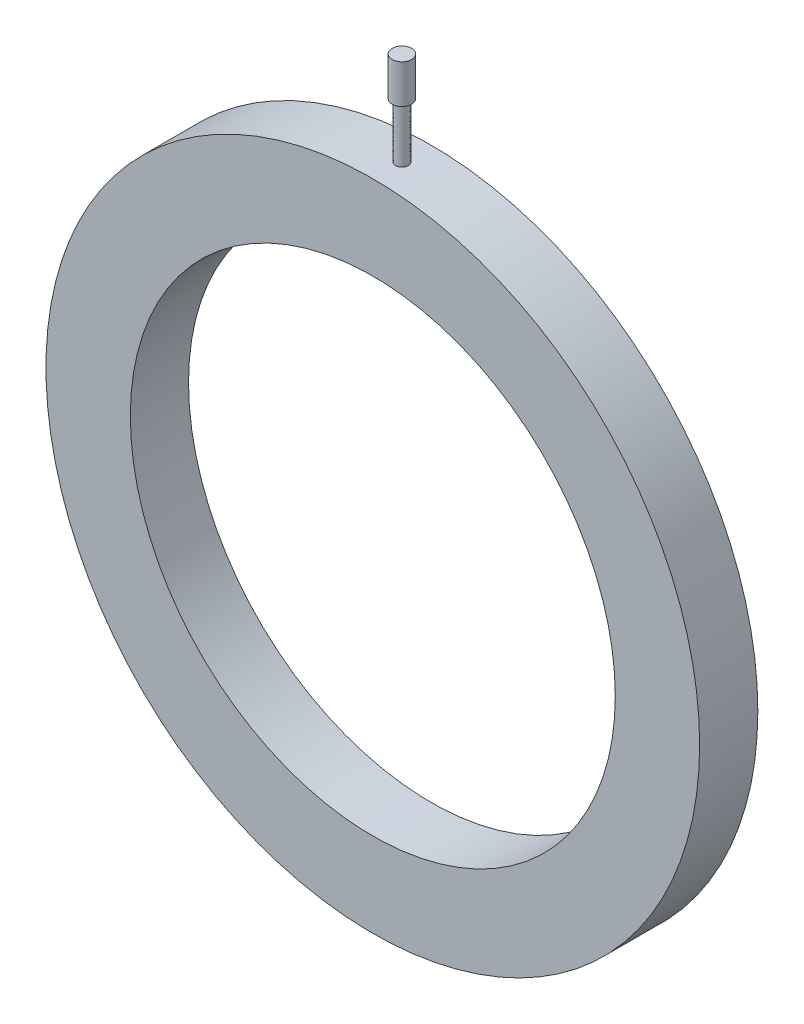
ISO-10303-21;
HEADER;
FILE_DESCRIPTION(('STEP AP214'),'2;1');
FILE_NAME('part.step','',(''),(''),'','','');
FILE_SCHEMA(('AUTOMOTIVE_DESIGN { 1 0 10303 214 1 1 1 1 }'));
ENDSEC;
DATA;
#1=APPLICATION_CONTEXT('core data for automotive mechanical design processes');
#2=APPLICATION_PROTOCOL_DEFINITION('international standard','automotive_design',2000,#1);
#3=PRODUCT_CONTEXT('',#1,'mechanical');
#4=PRODUCT('Part','Part','',(#3));
#5=PRODUCT_RELATED_PRODUCT_CATEGORY('part','',(#4));
#6=PRODUCT_DEFINITION_FORMATION('','',#4);
#7=PRODUCT_DEFINITION_CONTEXT('part definition',#1,'design');
#8=PRODUCT_DEFINITION('design','',#6,#7);
#9=PRODUCT_DEFINITION_SHAPE('','',#8);
#10=(LENGTH_UNIT() NAMED_UNIT(*) SI_UNIT(.MILLI.,.METRE.));
#11=(NAMED_UNIT(*) PLANE_ANGLE_UNIT() SI_UNIT($,.RADIAN.));
#12=(NAMED_UNIT(*) SI_UNIT($,.STERADIAN.) SOLID_ANGLE_UNIT());
#13=UNCERTAINTY_MEASURE_WITH_UNIT(LENGTH_MEASURE(1.E-05),#10,'distance_accuracy_value','');
#14=(GEOMETRIC_REPRESENTATION_CONTEXT(3) GLOBAL_UNCERTAINTY_ASSIGNED_CONTEXT((#13)) GLOBAL_UNIT_ASSIGNED_CONTEXT((#10,
#11,#12)) REPRESENTATION_CONTEXT('',''));
#15=CARTESIAN_POINT('',(0.,0.,0.));
#16=DIRECTION('',(0.,0.,1.));
#17=DIRECTION('',(1.,0.,0.));
#18=AXIS2_PLACEMENT_3D('',#15,#16,#17);
#19=CARTESIAN_POINT('',(0.,50.546,3.5));
#20=CARTESIAN_POINT('',(-0.111911598952046,50.546,3.5));
#21=CARTESIAN_POINT('',(-0.225366475588303,50.5456079031926,3.51931978733763));
#22=CARTESIAN_POINT('',(-0.330968906694718,50.5449164168149,3.55635833983376));
#23=CARTESIAN_POINT('',(-0.436570837437821,50.5442249337135,3.59339671683455));
#24=CARTESIAN_POINT('',(-0.537232899750638,50.5432204655615,3.64917467579839));
#25=CARTESIAN_POINT('',(-0.624623130942026,50.5421404566951,3.71907366269783));
#26=CARTESIAN_POINT('',(-0.712024108769298,50.5410603150168,3.78898124528297));
#27=CARTESIAN_POINT('',(-0.788560649689401,50.5398833580279,3.87494137994524));
#28=CARTESIAN_POINT('',(-0.84789656054588,50.5388878728313,3.96983830521767));
#29=CARTESIAN_POINT('',(-0.907237224396093,50.5378923078932,4.06474283203333));
#30=CARTESIAN_POINT('',(-0.95101108763605,50.5370586630187,4.17120392219146));
#31=CARTESIAN_POINT('',(-0.975591019428534,50.5365841560627,4.28040454738225));
#32=CARTESIAN_POINT('',(-1.00016766636695,50.5361097125197,4.38959057903712));
#33=CARTESIAN_POINT('',(-1.00623320587492,50.53598498555,4.50452733974727));
#34=CARTESIAN_POINT('',(-0.993284863372345,50.5362394839604,4.61569433951314));
#35=CARTESIAN_POINT('',(-0.980338318025382,50.5364939470478,4.72684590993757));
#36=CARTESIAN_POINT('',(-0.948026505290067,50.5371325219994,4.83729413699021));
#37=CARTESIAN_POINT('',(-0.899026086458855,50.5380041958116,4.93789507403769));
#38=CARTESIAN_POINT('',(-0.850022103975392,50.5388759330179,5.03850332748704));
#39=CARTESIAN_POINT('',(-0.782976100511717,50.5399979414956,5.13203747628009));
#40=CARTESIAN_POINT('',(-0.703438217319861,50.5411049609564,5.21075641004064));
#41=CARTESIAN_POINT('',(-0.623886755412766,50.5422121694077,5.2894887827053));
#42=CARTESIAN_POINT('',(-0.529644752173457,50.5433261715744,5.35557241008337));
#43=CARTESIAN_POINT('',(-0.428514566014879,50.5441835552491,5.40353487299223));
#44=CARTESIAN_POINT('',(-0.327384150738005,50.5450409408663,5.45149744456377));
#45=CARTESIAN_POINT('',(-0.216575425306659,50.5456585748031,5.48266145527986));
#46=CARTESIAN_POINT('',(-0.105266747864196,50.5458903859829,5.49444402144821));
#47=CARTESIAN_POINT('',(0.00602304381319857,50.5461221578312,5.50622458846626));
#48=CARTESIAN_POINT('',(0.120882265576095,50.5459728007476,5.4989551971356));
#49=CARTESIAN_POINT('',(0.229798062640977,50.5454776300552,5.47323833175972));
#50=CARTESIAN_POINT('',(0.338705497960881,50.5449824973783,5.44752344073354));
#51=CARTESIAN_POINT('',(0.444673810777598,50.544131872539,5.40265526205848));
#52=CARTESIAN_POINT('',(0.53893162993413,50.5431268195613,5.34234951074749));
#53=CARTESIAN_POINT('',(0.633202260419504,50.5421216299789,5.28203556280287));
#54=CARTESIAN_POINT('',(0.718359165086208,50.5409421907743,5.20461669658747));
#55=CARTESIAN_POINT('',(0.787353845513031,50.5398673318595,5.11650135600487));
#56=CARTESIAN_POINT('',(0.856357946292205,50.5387923261863,5.02837398438523));
#57=CARTESIAN_POINT('',(0.911098592024672,50.5378007800173,4.92711597621148));
#58=CARTESIAN_POINT('',(0.947041205229393,50.5371272329126,4.82111206081002));
#59=CARTESIAN_POINT('',(0.982981088193452,50.5364537369713,4.71511619758325));
#60=CARTESIAN_POINT('',(1.00111685081019,50.5360849534697,4.60145098467676));
#61=CARTESIAN_POINT('',(0.999945208080117,50.5361081364685,4.48953191337386));
#62=CARTESIAN_POINT('',(0.998773764456815,50.5361313155276,4.37763186138809));
#63=CARTESIAN_POINT('',(0.978269372745251,50.536546776275,4.26439116009279));
#64=CARTESIAN_POINT('',(0.940131033497124,50.5372562535785,4.15918679624224));
#65=CARTESIAN_POINT('',(0.901992641691982,50.5379657318597,4.05398228741349));
#66=CARTESIAN_POINT('',(0.845169021768142,50.5389831688344,3.95391284879169));
#67=CARTESIAN_POINT('',(0.774364797437619,50.5400680169753,3.86726059037753));
#68=CARTESIAN_POINT('',(0.703548498169693,50.541153050126,3.78059355430559));
#69=CARTESIAN_POINT('',(0.616793682654658,50.5423268658344,3.70495793610581));
#70=CARTESIAN_POINT('',(0.521281958487501,50.5433119326361,3.64661549126116));
#71=CARTESIAN_POINT('',(0.425763212289013,50.54429707186,3.58826875707424));
#72=CARTESIAN_POINT('',(0.318850977644257,50.5451128183985,3.54560857546906));
#73=CARTESIAN_POINT('',(0.209399778575461,50.5455662519744,3.52216988554629));
#74=CARTESIAN_POINT('',(0.140766264622946,50.545850586362,3.50747219684549));
#75=CARTESIAN_POINT('',(0.0701901854724699,50.546,3.5));
#76=CARTESIAN_POINT('',(0.,50.546,3.5));
#77=B_SPLINE_CURVE_WITH_KNOTS('',3,(#19,#20,#21,#22,#23,#24,#25,#26,#27,#28,#29,#30,#31,#32,#33,
#34,#35,#36,#37,#38,#39,#40,#41,#42,#43,#44,#45,#46,#47,#48,#49,#50,#51,#52,#53,#54,#55,#56,#57,
#58,#59,#60,#61,#62,#63,#64,#65,#66,#67,#68,#69,#70,#71,#72,#73,#74,#75,#76),.UNSPECIFIED.,.T.,
.F.,(4,3,3,3,3,3,3,3,3,3,3,3,3,3,3,3,3,3,3,4),(0.,0.0536972900592062,0.107394132483115,
0.161097687955145,0.214805820106656,0.268506714156708,0.322199853392017,0.375896825844486,
0.429603235277987,0.483309956707417,0.537007379391264,0.590700407651064,0.644400800388143,
0.698108826628485,0.751812838921593,0.805507452161114,0.859201954072253,0.912905804182396,
0.966613871982654,1.),.UNSPECIFIED.);
#78=DIRECTION('',(0.,1.,0.));
#79=VECTOR('',#78,1.);
#80=SURFACE_OF_LINEAR_EXTRUSION('',#77,#79);
#81=CARTESIAN_POINT('',(-0.000745795868137293,50.545999994498,5.49992582400753));
#82=CARTESIAN_POINT('',(-0.0287508288667636,50.545999596611,5.49992834047501));
#83=CARTESIAN_POINT('',(-0.0567527014368248,50.5459758451664,5.49876656907399));
#84=CARTESIAN_POINT('',(-0.112561475172319,50.545882366608,5.49404296220017));
#85=CARTESIAN_POINT('',(-0.14036833898554,50.5458126309168,5.49048067896803));
#86=CARTESIAN_POINT('',(-0.195607395579898,50.545629065743,5.48102131131705));
#87=CARTESIAN_POINT('',(-0.223039194822906,50.5455151931507,5.47512194408669));
#88=CARTESIAN_POINT('',(-0.277320116600577,50.54524652403,5.46107527835488));
#89=CARTESIAN_POINT('',(-0.304169241653974,50.5450917276786,5.45292798957264));
#90=CARTESIAN_POINT('',(-0.357089446086972,50.5447455505968,5.43443490584834));
#91=CARTESIAN_POINT('',(-0.383160822554985,50.544554184048,5.42408996296556));
#92=CARTESIAN_POINT('',(-0.434317898357769,50.54414049811,5.40119944859301));
#93=CARTESIAN_POINT('',(-0.459403649968717,50.5439181803653,5.38865399400873));
#94=CARTESIAN_POINT('',(-0.508419278146441,50.5434488977318,5.36149639657445));
#95=CARTESIAN_POINT('',(-0.532349455124184,50.5432019393005,5.34688479477651));
#96=CARTESIAN_POINT('',(-0.578921375219606,50.5426899603286,5.31573350408853));
#97=CARTESIAN_POINT('',(-0.601563025611571,50.5424249384912,5.29919367669881));
#98=CARTESIAN_POINT('',(-0.645472240908169,50.5418832752351,5.26423166625794));
#99=CARTESIAN_POINT('',(-0.666734849000402,50.5416065972245,5.24580324755426));
#100=CARTESIAN_POINT('',(-0.707592814987165,50.5410511016949,5.20718431929339));
#101=CARTESIAN_POINT('',(-0.727188293849174,50.5407722843328,5.18699393780056));
#102=CARTESIAN_POINT('',(-0.764598555557314,50.5402201722664,5.14502860947626));
#103=CARTESIAN_POINT('',(-0.782413355260644,50.53994687751,5.12325367764866));
#104=CARTESIAN_POINT('',(-0.816177024446774,50.5394128988649,5.07830053901208));
#105=CARTESIAN_POINT('',(-0.832125751455995,50.53915221594,5.05512222526044));
#106=CARTESIAN_POINT('',(-0.862041331397469,50.5386507968645,5.00751310714544));
#107=CARTESIAN_POINT('',(-0.876007904200675,50.5384100635352,4.98308212641106));
#108=CARTESIAN_POINT('',(-0.901783933358213,50.5379567102594,4.93310877666699));
#109=CARTESIAN_POINT('',(-0.913593555899844,50.5377440881474,4.90756649346813));
#110=CARTESIAN_POINT('',(-0.935006999453715,50.5373524490529,4.85557665901711));
#111=CARTESIAN_POINT('',(-0.944610924017221,50.537173430493,4.82912915032974));
#112=CARTESIAN_POINT('',(-0.961593056122124,50.5368531559238,4.77552733694854));
#113=CARTESIAN_POINT('',(-0.968971091694337,50.5367119028325,4.74837297782038));
#114=CARTESIAN_POINT('',(-0.981440437249872,50.5364712807784,4.69354437104248));
#115=CARTESIAN_POINT('',(-0.986531930884002,50.536371908452,4.66587016533193));
#116=CARTESIAN_POINT('',(-0.994311879411236,50.5362194395968,4.61018723447966));
#117=CARTESIAN_POINT('',(-0.997000520442221,50.5361663394835,4.58217853541996));
#118=CARTESIAN_POINT('',(-0.999997247508299,50.5361071282541,4.52603730668057));
#119=CARTESIAN_POINT('',(-1.00030544856023,50.5361010148677,4.49790478304948));
#120=CARTESIAN_POINT('',(-0.998588199423156,50.5361349759829,4.44170972196461));
#121=CARTESIAN_POINT('',(-0.996562568687938,50.536175054058,4.41364719009373));
#122=CARTESIAN_POINT('',(-0.990182056012727,50.536300476109,4.35778908314903));
#123=CARTESIAN_POINT('',(-0.985827397550119,50.536385815742,4.32999348272275));
#124=CARTESIAN_POINT('',(-0.974740512662284,50.5366008695229,4.27488213424014));
#125=CARTESIAN_POINT('',(-0.968008470734579,50.5367305802273,4.24756634912024));
#126=CARTESIAN_POINT('',(-0.952257774542837,50.537029820618,4.19360578707105));
#127=CARTESIAN_POINT('',(-0.943239224403168,50.537199348491,4.16696097964711));
#128=CARTESIAN_POINT('',(-0.923023904846764,50.5375726074118,4.11450966226067));
#129=CARTESIAN_POINT('',(-0.911826966326779,50.5377763411148,4.08870321755993));
#130=CARTESIAN_POINT('',(-0.887321732300565,50.5382125383431,4.03810768415451));
#131=CARTESIAN_POINT('',(-0.874013208793263,50.5384450049702,4.01331870567626));
#132=CARTESIAN_POINT('',(-0.845311335195001,50.538933211525,3.9649804649957));
#133=CARTESIAN_POINT('',(-0.829918146894317,50.5391889496461,3.94143110678356));
#134=CARTESIAN_POINT('',(-0.797195753652079,50.5397156960282,3.89572228099655));
#135=CARTESIAN_POINT('',(-0.779866625906903,50.5399867036802,3.87356275805643));
#136=CARTESIAN_POINT('',(-0.743430057988513,50.5405358079115,3.83075568363128));
#137=CARTESIAN_POINT('',(-0.724322479717947,50.5408139050403,3.81010824978334));
#138=CARTESIAN_POINT('',(-0.684449073355618,50.5413696225792,3.77046993158395));
#139=CARTESIAN_POINT('',(-0.663682879765802,50.5416472428706,3.75147941429605));
#140=CARTESIAN_POINT('',(-0.620592747874954,50.5421946910248,3.71535865018384));
#141=CARTESIAN_POINT('',(-0.598268930069496,50.5424645194882,3.69822825972428));
#142=CARTESIAN_POINT('',(-0.552254114001593,50.5429882456454,3.66592068760539));
#143=CARTESIAN_POINT('',(-0.528563196464811,50.543242144278,3.65074339078872));
#144=CARTESIAN_POINT('',(-0.480003136543992,50.5437266398016,3.62240471640727));
#145=CARTESIAN_POINT('',(-0.45513390410137,50.5439572349074,3.60924349325744));
#146=CARTESIAN_POINT('',(-0.404382852204897,50.5443887548537,3.58503591747195));
#147=CARTESIAN_POINT('',(-0.378500985689044,50.5445896783131,3.57398966327008));
#148=CARTESIAN_POINT('',(-0.325882811496516,50.5449563067573,3.55416816850492));
#149=CARTESIAN_POINT('',(-0.299146566743899,50.5451220143289,3.54539276112726));
#150=CARTESIAN_POINT('',(-0.245029114853819,50.5454133330985,3.53013741702686));
#151=CARTESIAN_POINT('',(-0.217647914715205,50.5455389447313,3.5236574554069));
#152=CARTESIAN_POINT('',(-0.162441498991217,50.5457465156773,3.51298962766368));
#153=CARTESIAN_POINT('',(-0.134616256346677,50.5458284723196,3.50880190177835));
#154=CARTESIAN_POINT('',(-0.0787164942882705,50.545946431169,3.50276031582021));
#155=CARTESIAN_POINT('',(-0.0506420205998857,50.5459824416371,3.50090603619987));
#156=CARTESIAN_POINT('',(0.00556151740091237,50.5460075068659,3.49961465347934));
#157=CARTESIAN_POINT('',(0.0336905802305487,50.5459965628846,3.50017748561805));
#158=CARTESIAN_POINT('',(0.089801489698009,50.5459280093025,3.50365998570049));
#159=CARTESIAN_POINT('',(0.117783341635606,50.5458704013933,3.50657956820576));
#160=CARTESIAN_POINT('',(0.173397576897857,50.5457102454271,3.51475320817803));
#161=CARTESIAN_POINT('',(0.201029972574881,50.545607698963,3.52000718289181));
#162=CARTESIAN_POINT('',(0.282879244802963,50.5452376815727,3.53923694706426));
#163=CARTESIAN_POINT('',(0.336314972999814,50.544907464651,3.55669687879736));
#164=CARTESIAN_POINT('',(0.439570745902454,50.5441150123426,3.60014955167793));
#165=CARTESIAN_POINT('',(0.489390687859636,50.5436527732062,3.62614253519049));
#166=CARTESIAN_POINT('',(0.584069108334099,50.5426477238313,3.68635907109661));
#167=CARTESIAN_POINT('',(0.628906824349573,50.5421045969905,3.72061530873321));
#168=CARTESIAN_POINT('',(0.712327680809762,50.5409976209772,3.7960428025939));
#169=CARTESIAN_POINT('',(0.750910822821152,50.54043377181,3.83721405708588));
#170=CARTESIAN_POINT('',(0.820465731250208,50.5393527323506,3.92555417769933));
#171=CARTESIAN_POINT('',(0.851437093960719,50.538835544534,3.97272336173272));
#172=CARTESIAN_POINT('',(0.905190346646854,50.5379012649122,4.07151853973593));
#173=CARTESIAN_POINT('',(0.927972228300186,50.5374841732085,4.12314453823478));
#174=CARTESIAN_POINT('',(0.964364040483428,50.5368029993684,4.22953031764043));
#175=CARTESIAN_POINT('',(0.977974699285987,50.5365389050829,4.28428984934345));
#176=CARTESIAN_POINT('',(0.995993955232421,50.536186949939,4.39530309676047));
#177=CARTESIAN_POINT('',(1.00040256484457,50.5360990888418,4.45155681044983));
#178=CARTESIAN_POINT('',(0.999528638912442,50.5361163770335,4.56397920236536));
#179=CARTESIAN_POINT('',(0.994247761638284,50.536221493296,4.62014789349591));
#180=CARTESIAN_POINT('',(0.974511573509295,50.5366059663876,4.73084929720762));
#181=CARTESIAN_POINT('',(0.960056216203592,50.5368853240988,4.78538200150423));
#182=CARTESIAN_POINT('',(0.922028500181199,50.5375932603584,4.89117068567565));
#183=CARTESIAN_POINT('',(0.898455893354145,50.5380218429676,4.94242657633333));
#184=CARTESIAN_POINT('',(0.843196139782982,50.5389741165655,5.04035563569638));
#185=CARTESIAN_POINT('',(0.811509361605328,50.539497803234,5.08702901241811));
#186=CARTESIAN_POINT('',(0.740616394070502,50.5405861383464,5.1742688769428));
#187=CARTESIAN_POINT('',(0.701409729811509,50.5411507893758,5.21483497876534));
#188=CARTESIAN_POINT('',(0.616840469138782,50.5422537853938,5.2889701161044));
#189=CARTESIAN_POINT('',(0.571476251264535,50.5427921234025,5.32253730268123));
#190=CARTESIAN_POINT('',(0.475666621606845,50.5437844127514,5.38141646341364));
#191=CARTESIAN_POINT('',(0.425220159141986,50.544238346587,5.40672672596563));
#192=CARTESIAN_POINT('',(0.32085692459148,50.5450085246239,5.44869302818245));
#193=CARTESIAN_POINT('',(0.266942042999423,50.5453248431159,5.46535373819227));
#194=CARTESIAN_POINT('',(0.177106642621568,50.5457018464996,5.48483033968586));
#195=CARTESIAN_POINT('',(0.141778426448211,50.545813669588,5.49047816626041));
#196=CARTESIAN_POINT('',(0.07071650137262,50.5459629984765,5.49802435761158));
#197=CARTESIAN_POINT('',(0.0349827807269526,50.5460005021187,5.49992261352029));
#198=CARTESIAN_POINT('',(-0.000745795868137293,50.545999994498,5.49992582400753));
#199=B_SPLINE_CURVE_WITH_KNOTS('',3,(#81,#82,#83,#84,#85,#86,#87,#88,#89,#90,#91,#92,#93,#94,
#95,#96,#97,#98,#99,#100,#101,#102,#103,#104,#105,#106,#107,#108,#109,#110,#111,#112,#113,#114,
#115,#116,#117,#118,#119,#120,#121,#122,#123,#124,#125,#126,#127,#128,#129,#130,#131,#132,#133,
#134,#135,#136,#137,#138,#139,#140,#141,#142,#143,#144,#145,#146,#147,#148,#149,#150,#151,#152,
#153,#154,#155,#156,#157,#158,#159,#160,#161,#162,#163,#164,#165,#166,#167,#168,#169,#170,#171,
#172,#173,#174,#175,#176,#177,#178,#179,#180,#181,#182,#183,#184,#185,#186,#187,#188,#189,#190,
#191,#192,#193,#194,#195,#196,#197,#198),.UNSPECIFIED.,.T.,.F.,(4,2,2,2,2,2,2,2,2,2,2,2,2,2,2,2,
2,2,2,2,2,2,2,2,2,2,2,2,2,2,2,2,2,2,2,2,2,2,2,2,2,2,2,2,2,2,2,2,2,2,2,2,2,2,2,2,2,2,4),(0.,
0.0839825547324108,0.167980778783795,0.252061253529152,0.336141364746082,0.420188936304373,
0.504232044061584,0.588253184470007,0.672280363631739,0.756594509815487,0.840902532908223,
0.925209757804572,1.00952341531468,1.09384897665895,1.17816803819902,1.26248314038871,
1.34680475498243,1.43111959580867,1.51542790458776,1.59973213977716,1.68404289721572,
1.76834556622842,1.8526416943456,1.9369339844249,2.02123282053241,2.10554076511602,
2.18984217032826,2.27414021518652,2.35844481128937,2.44276803656563,2.52708474593488,
2.61139648158428,2.69571467160568,2.78003678496683,2.86435270234141,2.94866770516788,
3.03298786577145,3.1172928636643,3.20159560280825,3.28589528589142,3.37019198082447,
3.53799413980425,3.70580106529723,3.87428295982579,4.04276481215214,4.21125559835002,
4.37974655577072,4.54822413200736,4.71670147996588,4.88514999720321,5.05359936731098,
5.22205332180305,5.39049962604169,5.55895657163991,5.72745796315506,5.89599426168817,
6.06443946377962,6.1715805631062,6.27872477320428),.UNSPECIFIED.);
#200=CARTESIAN_POINT('',(-0.000745795868137293,50.545999994498,5.49992582400753));
#201=VERTEX_POINT('',#200);
#202=EDGE_CURVE('E68',#201,#201,#199,.F.);
#203=ORIENTED_EDGE('',*,*,#202,.T.);
#204=EDGE_LOOP('',(#203));
#205=FACE_BOUND('',#204,.T.);
#206=CARTESIAN_POINT('',(0.,59.,3.5));
#207=CARTESIAN_POINT('',(0.0281350484196889,59.,3.4999938908261));
#208=CARTESIAN_POINT('',(0.0562671041041466,59.,3.50119807790303));
#209=CARTESIAN_POINT('',(0.112340251604671,59.,3.50595030158636));
#210=CARTESIAN_POINT('',(0.140281293155961,59.,3.50949893282477));
#211=CARTESIAN_POINT('',(0.195797923097401,59.,3.51895339663918));
#212=CARTESIAN_POINT('',(0.22337302751656,59.,3.52486208091926));
#213=CARTESIAN_POINT('',(0.277914922327901,59.,3.53901950083811));
#214=CARTESIAN_POINT('',(0.304881713792885,59.,3.54726823234971));
#215=CARTESIAN_POINT('',(0.3580178746462,59.,3.56597428152851));
#216=CARTESIAN_POINT('',(0.384187718803446,59.,3.57643025360188));
#217=CARTESIAN_POINT('',(0.435566329480924,59.,3.59948173810273));
#218=CARTESIAN_POINT('',(0.460775184113474,59.,3.61207705379507));
#219=CARTESIAN_POINT('',(0.510015604235693,59.,3.63937646993337));
#220=CARTESIAN_POINT('',(0.534047525250711,59.,3.65407992821917));
#221=CARTESIAN_POINT('',(0.580767226856682,59.,3.68548970809558));
#222=CARTESIAN_POINT('',(0.603454842086374,59.,3.70219627532487));
#223=CARTESIAN_POINT('',(0.647333398957274,59.,3.73741365137887));
#224=CARTESIAN_POINT('',(0.668526238258423,59.,3.75592209888567));
#225=CARTESIAN_POINT('',(0.70930030371732,59.,3.79463314913673));
#226=CARTESIAN_POINT('',(0.728881746546925,59.,3.81483552337199));
#227=CARTESIAN_POINT('',(0.766248549534404,59.,3.85684355762119));
#228=CARTESIAN_POINT('',(0.78403373203137,59.,3.87864937585747));
#229=CARTESIAN_POINT('',(0.817677640876873,59.,3.92370257283832));
#230=CARTESIAN_POINT('',(0.83353610256301,59.,3.94695014896778));
#231=CARTESIAN_POINT('',(0.863266352610144,59.,3.99467855372422));
#232=CARTESIAN_POINT('',(0.877138295188091,59.,4.01915928641944));
#233=CARTESIAN_POINT('',(0.902800479916052,59.,4.06918589776285));
#234=CARTESIAN_POINT('',(0.914591009203597,59.,4.09473162888916));
#235=CARTESIAN_POINT('',(0.935945545212599,59.,4.14673953215642));
#236=CARTESIAN_POINT('',(0.945509502661966,59.,4.17320172456298));
#237=CARTESIAN_POINT('',(0.962342704804306,59.,4.22684865550404));
#238=CARTESIAN_POINT('',(0.969611631848733,59.,4.2540334934938));
#239=CARTESIAN_POINT('',(0.981867177661955,59.,4.30891055517898));
#240=CARTESIAN_POINT('',(0.986853864154023,59.,4.33660276379331));
#241=CARTESIAN_POINT('',(0.994510363109326,59.,4.39230321542008));
#242=CARTESIAN_POINT('',(0.99718049633733,59.,4.42031141413429));
#243=CARTESIAN_POINT('',(1.00011637088644,59.,4.47645596795269));
#244=CARTESIAN_POINT('',(1.00038202783668,59.,4.50459232751927));
#245=CARTESIAN_POINT('',(0.998508835133296,59.,4.56078730207019));
#246=CARTESIAN_POINT('',(0.996369652257057,59.,4.5888459057403));
#247=CARTESIAN_POINT('',(0.98976969628691,59.,4.64468628185424));
#248=CARTESIAN_POINT('',(0.985309005206389,59.,4.67246806404217));
#249=CARTESIAN_POINT('',(0.974096753097461,59.,4.72756294908411));
#250=CARTESIAN_POINT('',(0.967345509651333,59.,4.75487611635977));
#251=CARTESIAN_POINT('',(0.951531742745203,59.,4.80882748859816));
#252=CARTESIAN_POINT('',(0.94246914019349,59.,4.83546567042947));
#253=CARTESIAN_POINT('',(0.922100729249718,59.,4.88787277623782));
#254=CARTESIAN_POINT('',(0.910794610169065,59.,4.91364157924185));
#255=CARTESIAN_POINT('',(0.886083241391401,59.,4.96414953988822));
#256=CARTESIAN_POINT('',(0.872678061877373,59.,4.98888873192105));
#257=CARTESIAN_POINT('',(0.843861087600052,59.,5.03716655229248));
#258=CARTESIAN_POINT('',(0.828449571072914,59.,5.06070534647189));
#259=CARTESIAN_POINT('',(0.79566900355228,59.,5.10638098453924));
#260=CARTESIAN_POINT('',(0.778299886516245,59.,5.12851778108936));
#261=CARTESIAN_POINT('',(0.741732632362646,59.,5.1712286086297));
#262=CARTESIAN_POINT('',(0.722534242222339,59.,5.19180242272074));
#263=CARTESIAN_POINT('',(0.682497454893455,59.,5.23128361932327));
#264=CARTESIAN_POINT('',(0.661659111743576,59.,5.25019105670067));
#265=CARTESIAN_POINT('',(0.618486301319902,59.,5.28620882105073));
#266=CARTESIAN_POINT('',(0.596152041700437,59.,5.30331939660991));
#267=CARTESIAN_POINT('',(0.550100380415623,59.,5.33556966293437));
#268=CARTESIAN_POINT('',(0.52638293177761,59.,5.35070928671025));
#269=CARTESIAN_POINT('',(0.477739415099218,59.,5.37890846798786));
#270=CARTESIAN_POINT('',(0.452813179997738,59.,5.39196773689801));
#271=CARTESIAN_POINT('',(0.401964787236741,59.,5.41597093676033));
#272=CARTESIAN_POINT('',(0.376042663493297,59.,5.42691493967379));
#273=CARTESIAN_POINT('',(0.323381484855886,59.,5.4466119148476));
#274=CARTESIAN_POINT('',(0.296642543759397,59.,5.455365190768));
#275=CARTESIAN_POINT('',(0.242511847428921,59.,5.47055404412516));
#276=CARTESIAN_POINT('',(0.215120070154956,59.,5.47698954319445));
#277=CARTESIAN_POINT('',(0.159884552061755,59.,5.48749771939897));
#278=CARTESIAN_POINT('',(0.132040749039216,59.,5.49157006845864));
#279=CARTESIAN_POINT('',(0.0761135770275025,59.,5.49738905455325));
#280=CARTESIAN_POINT('',(0.0480302164149084,59.,5.49913577257547));
#281=CARTESIAN_POINT('',(-0.00818213988420659,59.,5.50029130090378));
#282=CARTESIAN_POINT('',(-0.0363111286922351,59.,5.49970043582242));
#283=CARTESIAN_POINT('',(-0.0924179471702639,59.,5.49611550662026));
#284=CARTESIAN_POINT('',(-0.120395771681156,59.,5.49312136099262));
#285=CARTESIAN_POINT('',(-0.175995804752242,59.,5.48475388070553));
#286=CARTESIAN_POINT('',(-0.203617963377406,59.,5.47938021563324));
#287=CARTESIAN_POINT('',(-0.258318539643084,59.,5.4663589770031));
#288=CARTESIAN_POINT('',(-0.285396975801997,59.,5.45871148102936));
#289=CARTESIAN_POINT('',(-0.3388230486178,59.,5.44119526574493));
#290=CARTESIAN_POINT('',(-0.36517078624378,59.,5.4313268550589));
#291=CARTESIAN_POINT('',(-0.41692815295526,59.,5.40937235638841));
#292=CARTESIAN_POINT('',(-0.442337750345047,59.,5.39728619355787));
#293=CARTESIAN_POINT('',(-0.492033857678014,59.,5.37098651843389));
#294=CARTESIAN_POINT('',(-0.516320211190214,59.,5.3567727109902));
#295=CARTESIAN_POINT('',(-0.563627159422269,59.,5.32637931146892));
#296=CARTESIAN_POINT('',(-0.586647796115763,59.,5.31019978463558));
#297=CARTESIAN_POINT('',(-0.631264210071247,59.,5.27598659738902));
#298=CARTESIAN_POINT('',(-0.652860184673755,59.,5.25795319465896));
#299=CARTESIAN_POINT('',(-0.694432876699013,59.,5.22010425949598));
#300=CARTESIAN_POINT('',(-0.714409538512454,59.,5.20028866590957));
#301=CARTESIAN_POINT('',(-0.75259892532574,59.,5.15902180296857));
#302=CARTESIAN_POINT('',(-0.77081140506142,59.,5.13757030692261));
#303=CARTESIAN_POINT('',(-0.805391272921748,59.,5.09323130003831));
#304=CARTESIAN_POINT('',(-0.821758721380631,59.,5.07034383619558));
#305=CARTESIAN_POINT('',(-0.852535328733891,59.,5.02329091805563));
#306=CARTESIAN_POINT('',(-0.866944759250268,59.,4.99912564166773));
#307=CARTESIAN_POINT('',(-0.89364567727511,59.,4.94964943090102));
#308=CARTESIAN_POINT('',(-0.905937096052493,59.,4.92433845937718));
#309=CARTESIAN_POINT('',(-0.928314049756095,59.,4.8727569356158));
#310=CARTESIAN_POINT('',(-0.93839927791589,59.,4.84648625052391));
#311=CARTESIAN_POINT('',(-0.956353338783594,59.,4.7932006283477));
#312=CARTESIAN_POINT('',(-0.964222249339455,59.,4.76618571744084));
#313=CARTESIAN_POINT('',(-0.977689170693846,59.,4.7115981573556));
#314=CARTESIAN_POINT('',(-0.983287497113979,59.,4.68402558625432));
#315=CARTESIAN_POINT('',(-0.992106315453527,59.,4.62850028917077));
#316=CARTESIAN_POINT('',(-0.995326720027802,59.,4.60054754926265));
#317=CARTESIAN_POINT('',(-0.999368407096087,59.,4.54446674535428));
#318=CARTESIAN_POINT('',(-1.00018935569895,59.,4.51633865749956));
#319=CARTESIAN_POINT('',(-0.999493468562404,59.,4.46011382254497));
#320=CARTESIAN_POINT('',(-0.99797671492501,59.,4.43201707437911));
#321=CARTESIAN_POINT('',(-0.992615712304824,59.,4.37604896109701));
#322=CARTESIAN_POINT('',(-0.988771787257366,59.,4.34817756515947));
#323=CARTESIAN_POINT('',(-0.97871428512602,59.,4.2928632733361));
#324=CARTESIAN_POINT('',(-0.972500632836098,59.,4.26542039107841));
#325=CARTESIAN_POINT('',(-0.957751456967128,59.,4.21116330016707));
#326=CARTESIAN_POINT('',(-0.949215610543873,59.,4.18434917949074));
#327=CARTESIAN_POINT('',(-0.929948139833576,59.,4.13152391951522));
#328=CARTESIAN_POINT('',(-0.919216558520394,59.,4.10551276451223));
#329=CARTESIAN_POINT('',(-0.895631641056464,59.,4.05447356767699));
#330=CARTESIAN_POINT('',(-0.882778599408654,59.,4.02944538998317));
#331=CARTESIAN_POINT('',(-0.854978588069818,59.,3.98057834386515));
#332=CARTESIAN_POINT('',(-0.840031601398573,59.,3.95673948508751));
#333=CARTESIAN_POINT('',(-0.808154817498331,59.,3.91042356029508));
#334=CARTESIAN_POINT('',(-0.79122474834362,59.,3.88794668168142));
#335=CARTESIAN_POINT('',(-0.755560389900907,59.,3.84447982906117));
#336=CARTESIAN_POINT('',(-0.736826334818399,59.,3.82348966265211));
#337=CARTESIAN_POINT('',(-0.69768175041726,59.,3.78313881234357));
#338=CARTESIAN_POINT('',(-0.677271443408756,59.,3.76377791305259));
#339=CARTESIAN_POINT('',(-0.63486365680283,59.,3.72686638505621));
#340=CARTESIAN_POINT('',(-0.612865769077384,59.,3.70931622468484));
#341=CARTESIAN_POINT('',(-0.567449851438837,59.,3.67615813986097));
#342=CARTESIAN_POINT('',(-0.544031659088223,59.,3.66055043818911));
#343=CARTESIAN_POINT('',(-0.495971934968752,59.,3.63132800830313));
#344=CARTESIAN_POINT('',(-0.471329918872128,59.,3.61771407767618));
#345=CARTESIAN_POINT('',(-0.42100001043196,59.,3.59258051417855));
#346=CARTESIAN_POINT('',(-0.395312167563807,59.,3.58106078237724));
#347=CARTESIAN_POINT('',(-0.343069275825292,59.,3.5602711648156));
#348=CARTESIAN_POINT('',(-0.316515115964215,59.,3.55099905014716));
#349=CARTESIAN_POINT('',(-0.26272029473112,59.,3.53475868750549));
#350=CARTESIAN_POINT('',(-0.235479764636193,59.,3.52779000251803));
#351=CARTESIAN_POINT('',(-0.173834851628159,59.,3.51471711759888));
#352=CARTESIAN_POINT('',(-0.139297354643364,59.,3.50923390463555));
#353=CARTESIAN_POINT('',(-0.0698383519107733,59.,3.50187925404227));
#354=CARTESIAN_POINT('',(-0.0349168712595881,59.,3.50000758176191));
#355=CARTESIAN_POINT('',(0.,59.,3.5));
#356=B_SPLINE_CURVE_WITH_KNOTS('',3,(#206,#207,#208,#209,#210,#211,#212,#213,#214,#215,#216,
#217,#218,#219,#220,#221,#222,#223,#224,#225,#226,#227,#228,#229,#230,#231,#232,#233,#234,#235,
#236,#237,#238,#239,#240,#241,#242,#243,#244,#245,#246,#247,#248,#249,#250,#251,#252,#253,#254,
#255,#256,#257,#258,#259,#260,#261,#262,#263,#264,#265,#266,#267,#268,#269,#270,#271,#272,#273,
#274,#275,#276,#277,#278,#279,#280,#281,#282,#283,#284,#285,#286,#287,#288,#289,#290,#291,#292,
#293,#294,#295,#296,#297,#298,#299,#300,#301,#302,#303,#304,#305,#306,#307,#308,#309,#310,#311,
#312,#313,#314,#315,#316,#317,#318,#319,#320,#321,#322,#323,#324,#325,#326,#327,#328,#329,#330,
#331,#332,#333,#334,#335,#336,#337,#338,#339,#340,#341,#342,#343,#344,#345,#346,#347,#348,#349,
#350,#351,#352,#353,#354,#355),.UNSPECIFIED.,.T.,.F.,(4,2,2,2,2,2,2,2,2,2,2,2,2,2,2,2,2,2,2,2,2,
2,2,2,2,2,2,2,2,2,2,2,2,2,2,2,2,2,2,2,2,2,2,2,2,2,2,2,2,2,2,2,2,2,2,2,2,2,2,2,2,2,2,2,2,2,2,2,2,
2,2,2,2,2,4),(0.,0.0843758445821013,0.168773098013046,0.253272640512778,0.337772033980088,
0.422220062320652,0.506660328977576,0.591074928762038,0.675499890808829,0.759815668408927,
0.844120090139122,0.928432841932858,1.01275716221459,1.09707493269913,1.18138106217586,
1.2656890570963,1.35000871573327,1.43432587210396,1.51863135151814,1.60293978912264,
1.68725991022523,1.77157705269983,1.8558825094801,1.94019085147096,2.02451087688062,
2.10882808361599,2.19313360978428,2.27744198097563,2.36176203056981,2.44607930286522,
2.53038489489346,2.61469335158226,2.69901349356794,2.78333076648045,2.86763634556479,
2.95194477487809,3.0362649059125,3.12058210052352,3.20488758669104,3.28919593218472,
3.37351598815213,3.4578331674125,3.54213863694383,3.62644695219187,3.71076697367993,
3.795084197263,3.87938971681113,3.963698130295,4.04801824792472,4.13233560740795,
4.21664125817225,4.30094964420367,4.38526974570771,4.46958688510645,4.55389230001602,
4.63820081145379,4.72252105410305,4.80683833542359,4.89114388272715,4.97545210578737,
5.05977205583573,5.14409035577269,5.22839696040066,5.31270424872736,5.39702311106406,
5.48133104128432,5.5656278083056,5.64994632368353,5.73427450065959,5.81863632062577,
5.90299415427668,5.98726798687412,6.07152582157398,6.17624687608882,6.28096112639843),.UNSPECIFIED.);
#357=CARTESIAN_POINT('',(0.,59.,3.5));
#358=VERTEX_POINT('',#357);
#359=EDGE_CURVE('E50',#358,#358,#356,.T.);
#360=ORIENTED_EDGE('',*,*,#359,.T.);
#361=EDGE_LOOP('',(#360));
#362=FACE_BOUND('',#361,.T.);
#363=ADVANCED_FACE('F45',(#205,#362),#80,.T.);
#364=CARTESIAN_POINT('',(0.,0.,9.));
#365=DIRECTION('',(0.,0.,1.));
#366=DIRECTION('',(1.,0.,0.));
#367=AXIS2_PLACEMENT_3D('',#364,#365,#366);
#368=PLANE('',#367);
#369=CARTESIAN_POINT('',(0.,0.,9.));
#370=DIRECTION('',(0.,0.,1.));
#371=DIRECTION('',(1.,0.,0.));
#372=AXIS2_PLACEMENT_3D('',#369,#370,#371);
#373=CIRCLE('',#372,50.546);
#374=CARTESIAN_POINT('',(50.546,0.,9.));
#375=VERTEX_POINT('',#374);
#376=EDGE_CURVE('E12',#375,#375,#373,.T.);
#377=ORIENTED_EDGE('',*,*,#376,.T.);
#378=EDGE_LOOP('',(#377));
#379=FACE_BOUND('',#378,.T.);
#380=CARTESIAN_POINT('',(0.,0.,9.));
#381=DIRECTION('',(0.,0.,1.));
#382=DIRECTION('',(1.,0.,0.));
#383=AXIS2_PLACEMENT_3D('',#380,#381,#382);
#384=CIRCLE('',#383,37.5);
#385=CARTESIAN_POINT('',(37.5,0.,9.));
#386=VERTEX_POINT('',#385);
#387=EDGE_CURVE('E63',#386,#386,#384,.T.);
#388=ORIENTED_EDGE('',*,*,#387,.F.);
#389=EDGE_LOOP('',(#388));
#390=FACE_BOUND('',#389,.T.);
#391=ADVANCED_FACE('F77',(#379,#390),#368,.T.);
#392=CARTESIAN_POINT('',(0.,0.,0.));
#393=DIRECTION('',(0.,0.,1.));
#394=DIRECTION('',(1.,0.,0.));
#395=AXIS2_PLACEMENT_3D('',#392,#393,#394);
#396=PLANE('',#395);
#397=CARTESIAN_POINT('',(0.,0.,0.));
#398=DIRECTION('',(0.,0.,1.));
#399=DIRECTION('',(1.,0.,0.));
#400=AXIS2_PLACEMENT_3D('',#397,#398,#399);
#401=CIRCLE('',#400,50.546);
#402=CARTESIAN_POINT('',(50.546,0.,0.));
#403=VERTEX_POINT('',#402);
#404=EDGE_CURVE('E58',#403,#403,#401,.T.);
#405=ORIENTED_EDGE('',*,*,#404,.F.);
#406=EDGE_LOOP('',(#405));
#407=FACE_BOUND('',#406,.T.);
#408=CARTESIAN_POINT('',(0.,0.,0.));
#409=DIRECTION('',(0.,0.,1.));
#410=DIRECTION('',(1.,0.,0.));
#411=AXIS2_PLACEMENT_3D('',#408,#409,#410);
#412=CIRCLE('',#411,37.5);
#413=CARTESIAN_POINT('',(37.5,0.,0.));
#414=VERTEX_POINT('',#413);
#415=EDGE_CURVE('E66',#414,#414,#412,.T.);
#416=ORIENTED_EDGE('',*,*,#415,.T.);
#417=EDGE_LOOP('',(#416));
#418=FACE_BOUND('',#417,.T.);
#419=ADVANCED_FACE('F98',(#407,#418),#396,.F.);
#420=CARTESIAN_POINT('',(0.,0.,9.));
#421=DIRECTION('',(0.,0.,-1.));
#422=DIRECTION('',(-1.,0.,0.));
#423=AXIS2_PLACEMENT_3D('',#420,#421,#422);
#424=CYLINDRICAL_SURFACE('',#423,50.546);
#425=ORIENTED_EDGE('',*,*,#202,.F.);
#426=EDGE_LOOP('',(#425));
#427=FACE_BOUND('',#426,.T.);
#428=ORIENTED_EDGE('',*,*,#376,.F.);
#429=EDGE_LOOP('',(#428));
#430=FACE_BOUND('',#429,.T.);
#431=ORIENTED_EDGE('',*,*,#404,.T.);
#432=EDGE_LOOP('',(#431));
#433=FACE_BOUND('',#432,.T.);
#434=ADVANCED_FACE('F47',(#427,#430,#433),#424,.T.);
#435=CARTESIAN_POINT('',(0.,0.,9.));
#436=DIRECTION('',(0.,0.,-1.));
#437=DIRECTION('',(-1.,0.,0.));
#438=AXIS2_PLACEMENT_3D('',#435,#436,#437);
#439=CYLINDRICAL_SURFACE('',#438,37.5);
#440=ORIENTED_EDGE('',*,*,#387,.T.);
#441=EDGE_LOOP('',(#440));
#442=FACE_BOUND('',#441,.T.);
#443=ORIENTED_EDGE('',*,*,#415,.F.);
#444=EDGE_LOOP('',(#443));
#445=FACE_BOUND('',#444,.T.);
#446=ADVANCED_FACE('F80',(#442,#445),#439,.F.);
#447=CARTESIAN_POINT('',(0.,65.,4.5));
#448=DIRECTION('',(0.,-1.,0.));
#449=DIRECTION('',(0.,0.,-1.));
#450=AXIS2_PLACEMENT_3D('',#447,#448,#449);
#451=CYLINDRICAL_SURFACE('',#450,1.5);
#452=CARTESIAN_POINT('',(0.,65.,4.5));
#453=DIRECTION('',(0.,1.,0.));
#454=DIRECTION('',(0.,0.,1.));
#455=AXIS2_PLACEMENT_3D('',#452,#453,#454);
#456=CIRCLE('',#455,1.5);
#457=CARTESIAN_POINT('',(0.,65.,6.));
#458=VERTEX_POINT('',#457);
#459=EDGE_CURVE('E120',#458,#458,#456,.T.);
#460=ORIENTED_EDGE('',*,*,#459,.F.);
#461=EDGE_LOOP('',(#460));
#462=FACE_BOUND('',#461,.T.);
#463=CARTESIAN_POINT('',(0.,59.,4.5));
#464=DIRECTION('',(0.,1.,0.));
#465=DIRECTION('',(0.,0.,1.));
#466=AXIS2_PLACEMENT_3D('',#463,#464,#465);
#467=CIRCLE('',#466,1.5);
#468=CARTESIAN_POINT('',(0.,59.,6.));
#469=VERTEX_POINT('',#468);
#470=EDGE_CURVE('E87',#469,#469,#467,.T.);
#471=ORIENTED_EDGE('',*,*,#470,.T.);
#472=EDGE_LOOP('',(#471));
#473=FACE_BOUND('',#472,.T.);
#474=ADVANCED_FACE('F79',(#462,#473),#451,.T.);
#475=CARTESIAN_POINT('',(0.,65.,4.5));
#476=DIRECTION('',(0.,1.,0.));
#477=DIRECTION('',(0.,0.,1.));
#478=AXIS2_PLACEMENT_3D('',#475,#476,#477);
#479=PLANE('',#478);
#480=ORIENTED_EDGE('',*,*,#459,.T.);
#481=EDGE_LOOP('',(#480));
#482=FACE_BOUND('',#481,.T.);
#483=ADVANCED_FACE('F105',(#482),#479,.T.);
#484=CARTESIAN_POINT('',(0.,59.,4.5));
#485=DIRECTION('',(0.,1.,0.));
#486=DIRECTION('',(0.,0.,1.));
#487=AXIS2_PLACEMENT_3D('',#484,#485,#486);
#488=PLANE('',#487);
#489=ORIENTED_EDGE('',*,*,#359,.F.);
#490=EDGE_LOOP('',(#489));
#491=FACE_BOUND('',#490,.T.);
#492=ORIENTED_EDGE('',*,*,#470,.F.);
#493=EDGE_LOOP('',(#492));
#494=FACE_BOUND('',#493,.T.);
#495=ADVANCED_FACE('F128',(#491,#494),#488,.F.);
#496=CLOSED_SHELL('',(#363,#391,#419,#434,#446,#474,#483,#495));
#497=MANIFOLD_SOLID_BREP('B2',#496);
#498=ADVANCED_BREP_SHAPE_REPRESENTATION('',(#18,#497),#14);
#499=SHAPE_DEFINITION_REPRESENTATION(#9,#498);
ENDSEC;
END-ISO-10303-21;
